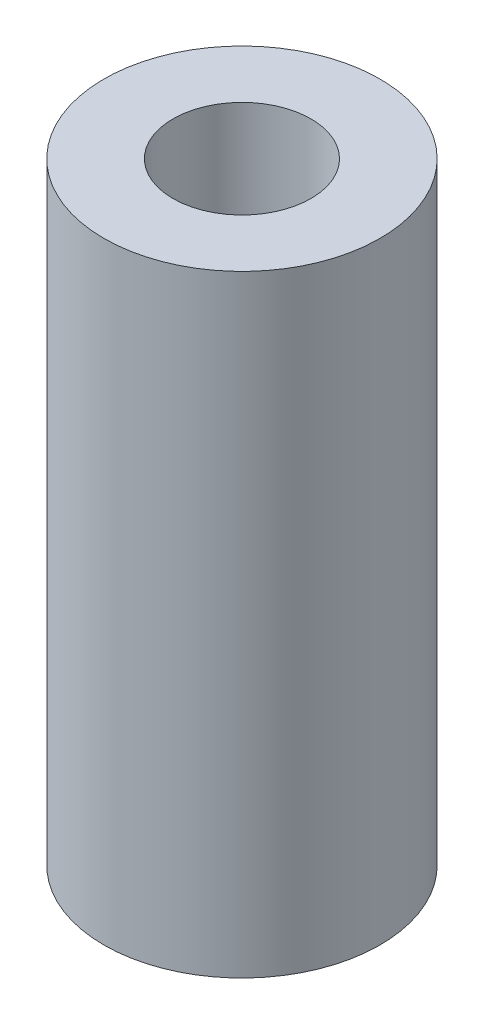
ISO-10303-21;
HEADER;
FILE_DESCRIPTION(('STEP AP214'),'2;1');
FILE_NAME('part.step','',(''),(''),'','','');
FILE_SCHEMA(('AUTOMOTIVE_DESIGN { 1 0 10303 214 1 1 1 1 }'));
ENDSEC;
DATA;
#1=APPLICATION_CONTEXT('core data for automotive mechanical design processes');
#2=APPLICATION_PROTOCOL_DEFINITION('international standard','automotive_design',2000,#1);
#3=PRODUCT_CONTEXT('',#1,'mechanical');
#4=PRODUCT('Part','Part','',(#3));
#5=PRODUCT_RELATED_PRODUCT_CATEGORY('part','',(#4));
#6=PRODUCT_DEFINITION_FORMATION('','',#4);
#7=PRODUCT_DEFINITION_CONTEXT('part definition',#1,'design');
#8=PRODUCT_DEFINITION('design','',#6,#7);
#9=PRODUCT_DEFINITION_SHAPE('','',#8);
#10=(LENGTH_UNIT() NAMED_UNIT(*) SI_UNIT(.MILLI.,.METRE.));
#11=(NAMED_UNIT(*) PLANE_ANGLE_UNIT() SI_UNIT($,.RADIAN.));
#12=(NAMED_UNIT(*) SI_UNIT($,.STERADIAN.) SOLID_ANGLE_UNIT());
#13=UNCERTAINTY_MEASURE_WITH_UNIT(LENGTH_MEASURE(1.E-05),#10,'distance_accuracy_value','');
#14=(GEOMETRIC_REPRESENTATION_CONTEXT(3) GLOBAL_UNCERTAINTY_ASSIGNED_CONTEXT((#13)) GLOBAL_UNIT_ASSIGNED_CONTEXT((#10,
#11,#12)) REPRESENTATION_CONTEXT('',''));
#15=CARTESIAN_POINT('',(0.,0.,0.));
#16=DIRECTION('',(0.,0.,1.));
#17=DIRECTION('',(1.,0.,0.));
#18=AXIS2_PLACEMENT_3D('',#15,#16,#17);
#19=CARTESIAN_POINT('',(0.,19.95,0.));
#20=DIRECTION('',(0.,1.,0.));
#21=DIRECTION('',(0.,0.,1.));
#22=AXIS2_PLACEMENT_3D('',#19,#20,#21);
#23=PLANE('',#22);
#24=CARTESIAN_POINT('',(0.,19.95,0.));
#25=DIRECTION('',(0.,1.,0.));
#26=DIRECTION('',(0.,0.,1.));
#27=AXIS2_PLACEMENT_3D('',#24,#25,#26);
#28=CIRCLE('',#27,4.5);
#29=CARTESIAN_POINT('',(0.,19.95,4.5));
#30=VERTEX_POINT('',#29);
#31=EDGE_CURVE('E12',#30,#30,#28,.T.);
#32=ORIENTED_EDGE('',*,*,#31,.T.);
#33=EDGE_LOOP('',(#32));
#34=FACE_BOUND('',#33,.T.);
#35=CARTESIAN_POINT('',(0.,19.95,0.));
#36=DIRECTION('',(0.,1.,0.));
#37=DIRECTION('',(0.,0.,1.));
#38=AXIS2_PLACEMENT_3D('',#35,#36,#37);
#39=CIRCLE('',#38,2.25);
#40=CARTESIAN_POINT('',(0.,19.95,2.25));
#41=VERTEX_POINT('',#40);
#42=EDGE_CURVE('E60',#41,#41,#39,.T.);
#43=ORIENTED_EDGE('',*,*,#42,.F.);
#44=EDGE_LOOP('',(#43));
#45=FACE_BOUND('',#44,.T.);
#46=ADVANCED_FACE('F47',(#34,#45),#23,.T.);
#47=CARTESIAN_POINT('',(0.,0.,0.));
#48=DIRECTION('',(0.,1.,0.));
#49=DIRECTION('',(0.,0.,1.));
#50=AXIS2_PLACEMENT_3D('',#47,#48,#49);
#51=PLANE('',#50);
#52=CARTESIAN_POINT('',(0.,0.,0.));
#53=DIRECTION('',(0.,1.,0.));
#54=DIRECTION('',(0.,0.,1.));
#55=AXIS2_PLACEMENT_3D('',#52,#53,#54);
#56=CIRCLE('',#55,4.5);
#57=CARTESIAN_POINT('',(0.,0.,4.5));
#58=VERTEX_POINT('',#57);
#59=EDGE_CURVE('E51',#58,#58,#56,.T.);
#60=ORIENTED_EDGE('',*,*,#59,.F.);
#61=EDGE_LOOP('',(#60));
#62=FACE_BOUND('',#61,.T.);
#63=CARTESIAN_POINT('',(0.,0.,0.));
#64=DIRECTION('',(0.,1.,0.));
#65=DIRECTION('',(0.,0.,1.));
#66=AXIS2_PLACEMENT_3D('',#63,#64,#65);
#67=CIRCLE('',#66,2.25);
#68=CARTESIAN_POINT('',(0.,0.,2.25));
#69=VERTEX_POINT('',#68);
#70=EDGE_CURVE('E62',#69,#69,#67,.T.);
#71=ORIENTED_EDGE('',*,*,#70,.T.);
#72=EDGE_LOOP('',(#71));
#73=FACE_BOUND('',#72,.T.);
#74=ADVANCED_FACE('F74',(#62,#73),#51,.F.);
#75=CARTESIAN_POINT('',(0.,19.95,0.));
#76=DIRECTION('',(0.,-1.,0.));
#77=DIRECTION('',(0.,0.,-1.));
#78=AXIS2_PLACEMENT_3D('',#75,#76,#77);
#79=CYLINDRICAL_SURFACE('',#78,4.5);
#80=ORIENTED_EDGE('',*,*,#31,.F.);
#81=EDGE_LOOP('',(#80));
#82=FACE_BOUND('',#81,.T.);
#83=ORIENTED_EDGE('',*,*,#59,.T.);
#84=EDGE_LOOP('',(#83));
#85=FACE_BOUND('',#84,.T.);
#86=ADVANCED_FACE('F49',(#82,#85),#79,.T.);
#87=CARTESIAN_POINT('',(0.,19.95,0.));
#88=DIRECTION('',(0.,-1.,0.));
#89=DIRECTION('',(0.,0.,-1.));
#90=AXIS2_PLACEMENT_3D('',#87,#88,#89);
#91=CYLINDRICAL_SURFACE('',#90,2.25);
#92=ORIENTED_EDGE('',*,*,#42,.T.);
#93=EDGE_LOOP('',(#92));
#94=FACE_BOUND('',#93,.T.);
#95=ORIENTED_EDGE('',*,*,#70,.F.);
#96=EDGE_LOOP('',(#95));
#97=FACE_BOUND('',#96,.T.);
#98=ADVANCED_FACE('F70',(#94,#97),#91,.F.);
#99=CLOSED_SHELL('',(#46,#74,#86,#98));
#100=MANIFOLD_SOLID_BREP('B2',#99);
#101=ADVANCED_BREP_SHAPE_REPRESENTATION('',(#18,#100),#14);
#102=SHAPE_DEFINITION_REPRESENTATION(#9,#101);
ENDSEC;
END-ISO-10303-21;
